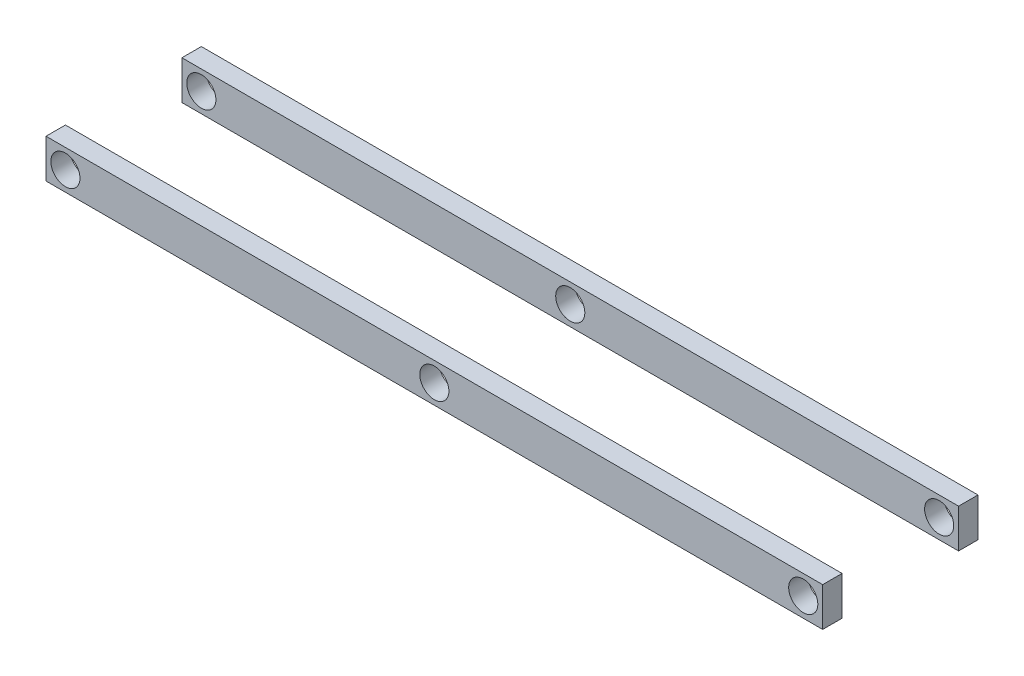
ISO-10303-21;
HEADER;
FILE_DESCRIPTION(('STEP AP214'),'2;1');
FILE_NAME('part.step','',(''),(''),'','','');
FILE_SCHEMA(('AUTOMOTIVE_DESIGN { 1 0 10303 214 1 1 1 1 }'));
ENDSEC;
DATA;
#1=APPLICATION_CONTEXT('core data for automotive mechanical design processes');
#2=APPLICATION_PROTOCOL_DEFINITION('international standard','automotive_design',2000,#1);
#3=PRODUCT_CONTEXT('',#1,'mechanical');
#4=PRODUCT('Part','Part','',(#3));
#5=PRODUCT_RELATED_PRODUCT_CATEGORY('part','',(#4));
#6=PRODUCT_DEFINITION_FORMATION('','',#4);
#7=PRODUCT_DEFINITION_CONTEXT('part definition',#1,'design');
#8=PRODUCT_DEFINITION('design','',#6,#7);
#9=PRODUCT_DEFINITION_SHAPE('','',#8);
#10=(LENGTH_UNIT() NAMED_UNIT(*) SI_UNIT(.MILLI.,.METRE.));
#11=(NAMED_UNIT(*) PLANE_ANGLE_UNIT() SI_UNIT($,.RADIAN.));
#12=(NAMED_UNIT(*) SI_UNIT($,.STERADIAN.) SOLID_ANGLE_UNIT());
#13=UNCERTAINTY_MEASURE_WITH_UNIT(LENGTH_MEASURE(1.E-05),#10,'distance_accuracy_value','');
#14=(GEOMETRIC_REPRESENTATION_CONTEXT(3) GLOBAL_UNCERTAINTY_ASSIGNED_CONTEXT((#13)) GLOBAL_UNIT_ASSIGNED_CONTEXT((#10,
#11,#12)) REPRESENTATION_CONTEXT('',''));
#15=CARTESIAN_POINT('',(0.,0.,0.));
#16=DIRECTION('',(0.,0.,1.));
#17=DIRECTION('',(1.,0.,0.));
#18=AXIS2_PLACEMENT_3D('',#15,#16,#17);
#19=CARTESIAN_POINT('',(0.,2.,0.));
#20=DIRECTION('',(1.,0.,0.));
#21=DIRECTION('',(0.,0.,-1.));
#22=AXIS2_PLACEMENT_3D('',#19,#20,#21);
#23=PLANE('',#22);
#24=DIRECTION('',(0.,0.,1.));
#25=VECTOR('',#24,1.);
#26=CARTESIAN_POINT('',(0.,0.,0.));
#27=LINE('',#26,#25);
#28=CARTESIAN_POINT('',(0.,0.,-8.));
#29=VERTEX_POINT('',#28);
#30=CARTESIAN_POINT('',(0.,0.,-7.));
#31=VERTEX_POINT('',#30);
#32=EDGE_CURVE('E94',#29,#31,#27,.T.);
#33=ORIENTED_EDGE('',*,*,#32,.T.);
#34=DIRECTION('',(0.,1.,0.));
#35=VECTOR('',#34,1.);
#36=CARTESIAN_POINT('',(0.,0.,-7.));
#37=LINE('',#36,#35);
#38=CARTESIAN_POINT('',(0.,2.,-7.));
#39=VERTEX_POINT('',#38);
#40=EDGE_CURVE('E84',#31,#39,#37,.T.);
#41=ORIENTED_EDGE('',*,*,#40,.T.);
#42=DIRECTION('',(0.,0.,1.));
#43=VECTOR('',#42,1.);
#44=CARTESIAN_POINT('',(0.,2.,0.));
#45=LINE('',#44,#43);
#46=CARTESIAN_POINT('',(0.,2.,-8.));
#47=VERTEX_POINT('',#46);
#48=EDGE_CURVE('E191',#47,#39,#45,.T.);
#49=ORIENTED_EDGE('',*,*,#48,.F.);
#50=DIRECTION('',(0.,-1.,0.));
#51=VECTOR('',#50,1.);
#52=CARTESIAN_POINT('',(0.,2.,-8.));
#53=LINE('',#52,#51);
#54=EDGE_CURVE('E93',#47,#29,#53,.T.);
#55=ORIENTED_EDGE('',*,*,#54,.T.);
#56=EDGE_LOOP('',(#33,#41,#49,#55));
#57=FACE_BOUND('',#56,.T.);
#58=ADVANCED_FACE('F49',(#57),#23,.F.);
#59=CARTESIAN_POINT('',(40.,2.,0.));
#60=DIRECTION('',(-1.,0.,0.));
#61=DIRECTION('',(0.,0.,1.));
#62=AXIS2_PLACEMENT_3D('',#59,#60,#61);
#63=PLANE('',#62);
#64=DIRECTION('',(0.,0.,-1.));
#65=VECTOR('',#64,1.);
#66=CARTESIAN_POINT('',(40.,2.,0.));
#67=LINE('',#66,#65);
#68=CARTESIAN_POINT('',(40.,2.,-7.));
#69=VERTEX_POINT('',#68);
#70=CARTESIAN_POINT('',(40.,2.,-8.));
#71=VERTEX_POINT('',#70);
#72=EDGE_CURVE('E186',#69,#71,#67,.T.);
#73=ORIENTED_EDGE('',*,*,#72,.F.);
#74=DIRECTION('',(0.,1.,0.));
#75=VECTOR('',#74,1.);
#76=CARTESIAN_POINT('',(40.,0.,-7.));
#77=LINE('',#76,#75);
#78=CARTESIAN_POINT('',(40.,0.,-7.));
#79=VERTEX_POINT('',#78);
#80=EDGE_CURVE('E12',#79,#69,#77,.T.);
#81=ORIENTED_EDGE('',*,*,#80,.F.);
#82=DIRECTION('',(0.,0.,-1.));
#83=VECTOR('',#82,1.);
#84=CARTESIAN_POINT('',(40.,0.,0.));
#85=LINE('',#84,#83);
#86=CARTESIAN_POINT('',(40.,0.,-8.));
#87=VERTEX_POINT('',#86);
#88=EDGE_CURVE('E101',#79,#87,#85,.T.);
#89=ORIENTED_EDGE('',*,*,#88,.T.);
#90=DIRECTION('',(0.,-1.,0.));
#91=VECTOR('',#90,1.);
#92=CARTESIAN_POINT('',(40.,2.,-8.));
#93=LINE('',#92,#91);
#94=EDGE_CURVE('E178',#71,#87,#93,.T.);
#95=ORIENTED_EDGE('',*,*,#94,.F.);
#96=EDGE_LOOP('',(#73,#81,#89,#95));
#97=FACE_BOUND('',#96,.T.);
#98=ADVANCED_FACE('F142',(#97),#63,.F.);
#99=CARTESIAN_POINT('',(0.,2.,0.));
#100=DIRECTION('',(0.,-1.,0.));
#101=DIRECTION('',(0.,0.,-1.));
#102=AXIS2_PLACEMENT_3D('',#99,#100,#101);
#103=PLANE('',#102);
#104=ORIENTED_EDGE('',*,*,#48,.T.);
#105=DIRECTION('',(-1.,0.,0.));
#106=VECTOR('',#105,1.);
#107=CARTESIAN_POINT('',(0.,2.,-7.));
#108=LINE('',#107,#106);
#109=EDGE_CURVE('E59',#69,#39,#108,.T.);
#110=ORIENTED_EDGE('',*,*,#109,.F.);
#111=ORIENTED_EDGE('',*,*,#72,.T.);
#112=DIRECTION('',(-1.,0.,0.));
#113=VECTOR('',#112,1.);
#114=CARTESIAN_POINT('',(0.,2.,-8.));
#115=LINE('',#114,#113);
#116=EDGE_CURVE('E104',#71,#47,#115,.T.);
#117=ORIENTED_EDGE('',*,*,#116,.T.);
#118=EDGE_LOOP('',(#104,#110,#111,#117));
#119=FACE_BOUND('',#118,.T.);
#120=ADVANCED_FACE('F146',(#119),#103,.F.);
#121=CARTESIAN_POINT('',(0.,0.,0.));
#122=DIRECTION('',(0.,-1.,0.));
#123=DIRECTION('',(0.,0.,-1.));
#124=AXIS2_PLACEMENT_3D('',#121,#122,#123);
#125=PLANE('',#124);
#126=DIRECTION('',(-1.,0.,0.));
#127=VECTOR('',#126,1.);
#128=CARTESIAN_POINT('',(0.,0.,-7.));
#129=LINE('',#128,#127);
#130=EDGE_CURVE('E87',#79,#31,#129,.T.);
#131=ORIENTED_EDGE('',*,*,#130,.T.);
#132=ORIENTED_EDGE('',*,*,#32,.F.);
#133=DIRECTION('',(-1.,0.,0.));
#134=VECTOR('',#133,1.);
#135=CARTESIAN_POINT('',(0.,0.,-8.));
#136=LINE('',#135,#134);
#137=EDGE_CURVE('E103',#87,#29,#136,.T.);
#138=ORIENTED_EDGE('',*,*,#137,.F.);
#139=ORIENTED_EDGE('',*,*,#88,.F.);
#140=EDGE_LOOP('',(#131,#132,#138,#139));
#141=FACE_BOUND('',#140,.T.);
#142=ADVANCED_FACE('F99',(#141),#125,.T.);
#143=CARTESIAN_POINT('',(0.,2.,-8.));
#144=DIRECTION('',(0.,0.,1.));
#145=DIRECTION('',(1.,0.,0.));
#146=AXIS2_PLACEMENT_3D('',#143,#144,#145);
#147=PLANE('',#146);
#148=CARTESIAN_POINT('',(20.,1.,-8.));
#149=DIRECTION('',(0.,0.,1.));
#150=DIRECTION('',(1.,0.,0.));
#151=AXIS2_PLACEMENT_3D('',#148,#149,#150);
#152=CIRCLE('',#151,0.750000000000002);
#153=CARTESIAN_POINT('',(20.75,1.,-8.));
#154=VERTEX_POINT('',#153);
#155=EDGE_CURVE('E119',#154,#154,#152,.T.);
#156=ORIENTED_EDGE('',*,*,#155,.T.);
#157=EDGE_LOOP('',(#156));
#158=FACE_BOUND('',#157,.T.);
#159=CARTESIAN_POINT('',(1.,1.,-8.));
#160=DIRECTION('',(0.,0.,1.));
#161=DIRECTION('',(1.,0.,0.));
#162=AXIS2_PLACEMENT_3D('',#159,#160,#161);
#163=CIRCLE('',#162,0.75);
#164=CARTESIAN_POINT('',(1.75,1.,-8.));
#165=VERTEX_POINT('',#164);
#166=EDGE_CURVE('E170',#165,#165,#163,.T.);
#167=ORIENTED_EDGE('',*,*,#166,.T.);
#168=EDGE_LOOP('',(#167));
#169=FACE_BOUND('',#168,.T.);
#170=CARTESIAN_POINT('',(39.,1.,-8.));
#171=DIRECTION('',(0.,0.,1.));
#172=DIRECTION('',(1.,0.,0.));
#173=AXIS2_PLACEMENT_3D('',#170,#171,#172);
#174=CIRCLE('',#173,0.749999999999999);
#175=CARTESIAN_POINT('',(39.75,1.,-8.));
#176=VERTEX_POINT('',#175);
#177=EDGE_CURVE('E174',#176,#176,#174,.T.);
#178=ORIENTED_EDGE('',*,*,#177,.T.);
#179=EDGE_LOOP('',(#178));
#180=FACE_BOUND('',#179,.T.);
#181=ORIENTED_EDGE('',*,*,#137,.T.);
#182=ORIENTED_EDGE('',*,*,#54,.F.);
#183=ORIENTED_EDGE('',*,*,#116,.F.);
#184=ORIENTED_EDGE('',*,*,#94,.T.);
#185=EDGE_LOOP('',(#181,#182,#183,#184));
#186=FACE_BOUND('',#185,.T.);
#187=ADVANCED_FACE('F156',(#158,#169,#180,#186),#147,.F.);
#188=CARTESIAN_POINT('',(0.,0.,-7.));
#189=DIRECTION('',(0.,0.,-1.));
#190=DIRECTION('',(-1.,0.,0.));
#191=AXIS2_PLACEMENT_3D('',#188,#189,#190);
#192=PLANE('',#191);
#193=CARTESIAN_POINT('',(20.,1.,-7.));
#194=DIRECTION('',(0.,0.,-1.));
#195=DIRECTION('',(-1.,0.,0.));
#196=AXIS2_PLACEMENT_3D('',#193,#194,#195);
#197=CIRCLE('',#196,0.750000000000002);
#198=CARTESIAN_POINT('',(19.25,1.,-7.));
#199=VERTEX_POINT('',#198);
#200=EDGE_CURVE('E52',#199,#199,#197,.T.);
#201=ORIENTED_EDGE('',*,*,#200,.T.);
#202=EDGE_LOOP('',(#201));
#203=FACE_BOUND('',#202,.T.);
#204=CARTESIAN_POINT('',(1.,1.,-7.));
#205=DIRECTION('',(0.,0.,-1.));
#206=DIRECTION('',(-1.,0.,0.));
#207=AXIS2_PLACEMENT_3D('',#204,#205,#206);
#208=CIRCLE('',#207,0.75);
#209=CARTESIAN_POINT('',(0.25,1.,-7.));
#210=VERTEX_POINT('',#209);
#211=EDGE_CURVE('E112',#210,#210,#208,.T.);
#212=ORIENTED_EDGE('',*,*,#211,.T.);
#213=EDGE_LOOP('',(#212));
#214=FACE_BOUND('',#213,.T.);
#215=CARTESIAN_POINT('',(39.,1.,-7.));
#216=DIRECTION('',(0.,0.,-1.));
#217=DIRECTION('',(-1.,0.,0.));
#218=AXIS2_PLACEMENT_3D('',#215,#216,#217);
#219=CIRCLE('',#218,0.749999999999999);
#220=CARTESIAN_POINT('',(38.25,1.,-7.));
#221=VERTEX_POINT('',#220);
#222=EDGE_CURVE('E116',#221,#221,#219,.T.);
#223=ORIENTED_EDGE('',*,*,#222,.T.);
#224=EDGE_LOOP('',(#223));
#225=FACE_BOUND('',#224,.T.);
#226=ORIENTED_EDGE('',*,*,#109,.T.);
#227=ORIENTED_EDGE('',*,*,#40,.F.);
#228=ORIENTED_EDGE('',*,*,#130,.F.);
#229=ORIENTED_EDGE('',*,*,#80,.T.);
#230=EDGE_LOOP('',(#226,#227,#228,#229));
#231=FACE_BOUND('',#230,.T.);
#232=ADVANCED_FACE('F86',(#203,#214,#225,#231),#192,.F.);
#233=CARTESIAN_POINT('',(39.,1.,-8.));
#234=DIRECTION('',(0.,0.,1.));
#235=DIRECTION('',(1.,0.,0.));
#236=AXIS2_PLACEMENT_3D('',#233,#234,#235);
#237=CYLINDRICAL_SURFACE('',#236,0.749999999999999);
#238=ORIENTED_EDGE('',*,*,#177,.F.);
#239=EDGE_LOOP('',(#238));
#240=FACE_BOUND('',#239,.T.);
#241=ORIENTED_EDGE('',*,*,#222,.F.);
#242=EDGE_LOOP('',(#241));
#243=FACE_BOUND('',#242,.T.);
#244=ADVANCED_FACE('F129',(#240,#243),#237,.F.);
#245=CARTESIAN_POINT('',(1.,1.,-8.));
#246=DIRECTION('',(0.,0.,1.));
#247=DIRECTION('',(1.,0.,0.));
#248=AXIS2_PLACEMENT_3D('',#245,#246,#247);
#249=CYLINDRICAL_SURFACE('',#248,0.75);
#250=ORIENTED_EDGE('',*,*,#166,.F.);
#251=EDGE_LOOP('',(#250));
#252=FACE_BOUND('',#251,.T.);
#253=ORIENTED_EDGE('',*,*,#211,.F.);
#254=EDGE_LOOP('',(#253));
#255=FACE_BOUND('',#254,.T.);
#256=ADVANCED_FACE('F126',(#252,#255),#249,.F.);
#257=CARTESIAN_POINT('',(20.,1.,-8.));
#258=DIRECTION('',(0.,0.,1.));
#259=DIRECTION('',(1.,0.,0.));
#260=AXIS2_PLACEMENT_3D('',#257,#258,#259);
#261=CYLINDRICAL_SURFACE('',#260,0.750000000000002);
#262=ORIENTED_EDGE('',*,*,#155,.F.);
#263=EDGE_LOOP('',(#262));
#264=FACE_BOUND('',#263,.T.);
#265=ORIENTED_EDGE('',*,*,#200,.F.);
#266=EDGE_LOOP('',(#265));
#267=FACE_BOUND('',#266,.T.);
#268=ADVANCED_FACE('F128',(#264,#267),#261,.F.);
#269=CLOSED_SHELL('',(#58,#98,#120,#142,#187,#232,#244,#256,#268));
#270=MANIFOLD_SOLID_BREP('B2',#269);
#271=CARTESIAN_POINT('',(0.,2.,0.));
#272=DIRECTION('',(0.,0.,-1.));
#273=DIRECTION('',(-1.,0.,0.));
#274=AXIS2_PLACEMENT_3D('',#271,#272,#273);
#275=PLANE('',#274);
#276=CARTESIAN_POINT('',(20.,1.,0.));
#277=DIRECTION('',(0.,0.,1.));
#278=DIRECTION('',(1.,0.,0.));
#279=AXIS2_PLACEMENT_3D('',#276,#277,#278);
#280=CIRCLE('',#279,0.750000000000002);
#281=CARTESIAN_POINT('',(20.75,1.,0.));
#282=VERTEX_POINT('',#281);
#283=EDGE_CURVE('E317',#282,#282,#280,.T.);
#284=ORIENTED_EDGE('',*,*,#283,.F.);
#285=EDGE_LOOP('',(#284));
#286=FACE_BOUND('',#285,.T.);
#287=CARTESIAN_POINT('',(1.,1.,0.));
#288=DIRECTION('',(0.,0.,1.));
#289=DIRECTION('',(1.,0.,0.));
#290=AXIS2_PLACEMENT_3D('',#287,#288,#289);
#291=CIRCLE('',#290,0.75);
#292=CARTESIAN_POINT('',(1.75,1.,0.));
#293=VERTEX_POINT('',#292);
#294=EDGE_CURVE('E386',#293,#293,#291,.T.);
#295=ORIENTED_EDGE('',*,*,#294,.F.);
#296=EDGE_LOOP('',(#295));
#297=FACE_BOUND('',#296,.T.);
#298=CARTESIAN_POINT('',(39.,1.,0.));
#299=DIRECTION('',(0.,0.,1.));
#300=DIRECTION('',(1.,0.,0.));
#301=AXIS2_PLACEMENT_3D('',#298,#299,#300);
#302=CIRCLE('',#301,0.749999999999999);
#303=CARTESIAN_POINT('',(39.75,1.,0.));
#304=VERTEX_POINT('',#303);
#305=EDGE_CURVE('E389',#304,#304,#302,.T.);
#306=ORIENTED_EDGE('',*,*,#305,.F.);
#307=EDGE_LOOP('',(#306));
#308=FACE_BOUND('',#307,.T.);
#309=DIRECTION('',(1.,0.,0.));
#310=VECTOR('',#309,1.);
#311=CARTESIAN_POINT('',(0.,0.,0.));
#312=LINE('',#311,#310);
#313=CARTESIAN_POINT('',(0.,0.,0.));
#314=VERTEX_POINT('',#313);
#315=CARTESIAN_POINT('',(40.,0.,0.));
#316=VERTEX_POINT('',#315);
#317=EDGE_CURVE('E292',#314,#316,#312,.T.);
#318=ORIENTED_EDGE('',*,*,#317,.T.);
#319=DIRECTION('',(0.,-1.,0.));
#320=VECTOR('',#319,1.);
#321=CARTESIAN_POINT('',(40.,2.,0.));
#322=LINE('',#321,#320);
#323=CARTESIAN_POINT('',(40.,2.,0.));
#324=VERTEX_POINT('',#323);
#325=EDGE_CURVE('E263',#324,#316,#322,.T.);
#326=ORIENTED_EDGE('',*,*,#325,.F.);
#327=DIRECTION('',(1.,0.,0.));
#328=VECTOR('',#327,1.);
#329=CARTESIAN_POINT('',(0.,2.,0.));
#330=LINE('',#329,#328);
#331=CARTESIAN_POINT('',(0.,2.,0.));
#332=VERTEX_POINT('',#331);
#333=EDGE_CURVE('E280',#332,#324,#330,.T.);
#334=ORIENTED_EDGE('',*,*,#333,.F.);
#335=DIRECTION('',(0.,-1.,0.));
#336=VECTOR('',#335,1.);
#337=CARTESIAN_POINT('',(0.,2.,0.));
#338=LINE('',#337,#336);
#339=EDGE_CURVE('E47',#332,#314,#338,.T.);
#340=ORIENTED_EDGE('',*,*,#339,.T.);
#341=EDGE_LOOP('',(#318,#326,#334,#340));
#342=FACE_BOUND('',#341,.T.);
#343=ADVANCED_FACE('F254',(#286,#297,#308,#342),#275,.F.);
#344=CARTESIAN_POINT('',(0.,2.,0.));
#345=DIRECTION('',(0.,-1.,0.));
#346=DIRECTION('',(0.,0.,-1.));
#347=AXIS2_PLACEMENT_3D('',#344,#345,#346);
#348=PLANE('',#347);
#349=DIRECTION('',(0.,0.,-1.));
#350=VECTOR('',#349,1.);
#351=CARTESIAN_POINT('',(40.,2.,0.));
#352=LINE('',#351,#350);
#353=CARTESIAN_POINT('',(40.,2.,-1.));
#354=VERTEX_POINT('',#353);
#355=EDGE_CURVE('E305',#324,#354,#352,.T.);
#356=ORIENTED_EDGE('',*,*,#355,.T.);
#357=DIRECTION('',(1.,0.,0.));
#358=VECTOR('',#357,1.);
#359=CARTESIAN_POINT('',(40.,2.,-1.));
#360=LINE('',#359,#358);
#361=CARTESIAN_POINT('',(0.,2.,-0.999999999999995));
#362=VERTEX_POINT('',#361);
#363=EDGE_CURVE('E322',#362,#354,#360,.T.);
#364=ORIENTED_EDGE('',*,*,#363,.F.);
#365=DIRECTION('',(0.,0.,1.));
#366=VECTOR('',#365,1.);
#367=CARTESIAN_POINT('',(0.,2.,0.));
#368=LINE('',#367,#366);
#369=EDGE_CURVE('E309',#362,#332,#368,.T.);
#370=ORIENTED_EDGE('',*,*,#369,.T.);
#371=ORIENTED_EDGE('',*,*,#333,.T.);
#372=EDGE_LOOP('',(#356,#364,#370,#371));
#373=FACE_BOUND('',#372,.T.);
#374=ADVANCED_FACE('F343',(#373),#348,.F.);
#375=CARTESIAN_POINT('',(0.,0.,0.));
#376=DIRECTION('',(0.,-1.,0.));
#377=DIRECTION('',(0.,0.,-1.));
#378=AXIS2_PLACEMENT_3D('',#375,#376,#377);
#379=PLANE('',#378);
#380=DIRECTION('',(1.,0.,0.));
#381=VECTOR('',#380,1.);
#382=CARTESIAN_POINT('',(40.,0.,-1.));
#383=LINE('',#382,#381);
#384=CARTESIAN_POINT('',(0.,0.,-0.999999999999995));
#385=VERTEX_POINT('',#384);
#386=CARTESIAN_POINT('',(40.,0.,-0.999999999999997));
#387=VERTEX_POINT('',#386);
#388=EDGE_CURVE('E308',#385,#387,#383,.T.);
#389=ORIENTED_EDGE('',*,*,#388,.T.);
#390=DIRECTION('',(0.,0.,-1.));
#391=VECTOR('',#390,1.);
#392=CARTESIAN_POINT('',(40.,0.,0.));
#393=LINE('',#392,#391);
#394=EDGE_CURVE('E299',#316,#387,#393,.T.);
#395=ORIENTED_EDGE('',*,*,#394,.F.);
#396=ORIENTED_EDGE('',*,*,#317,.F.);
#397=DIRECTION('',(0.,0.,1.));
#398=VECTOR('',#397,1.);
#399=CARTESIAN_POINT('',(0.,0.,0.));
#400=LINE('',#399,#398);
#401=EDGE_CURVE('E300',#385,#314,#400,.T.);
#402=ORIENTED_EDGE('',*,*,#401,.F.);
#403=EDGE_LOOP('',(#389,#395,#396,#402));
#404=FACE_BOUND('',#403,.T.);
#405=ADVANCED_FACE('F307',(#404),#379,.T.);
#406=CARTESIAN_POINT('',(40.,2.,0.));
#407=DIRECTION('',(-1.,0.,0.));
#408=DIRECTION('',(0.,0.,1.));
#409=AXIS2_PLACEMENT_3D('',#406,#407,#408);
#410=PLANE('',#409);
#411=ORIENTED_EDGE('',*,*,#394,.T.);
#412=DIRECTION('',(0.,1.,0.));
#413=VECTOR('',#412,1.);
#414=CARTESIAN_POINT('',(40.,0.,-1.));
#415=LINE('',#414,#413);
#416=EDGE_CURVE('E271',#387,#354,#415,.T.);
#417=ORIENTED_EDGE('',*,*,#416,.T.);
#418=ORIENTED_EDGE('',*,*,#355,.F.);
#419=ORIENTED_EDGE('',*,*,#325,.T.);
#420=EDGE_LOOP('',(#411,#417,#418,#419));
#421=FACE_BOUND('',#420,.T.);
#422=ADVANCED_FACE('F304',(#421),#410,.F.);
#423=CARTESIAN_POINT('',(0.,2.,0.));
#424=DIRECTION('',(1.,0.,0.));
#425=DIRECTION('',(0.,0.,-1.));
#426=AXIS2_PLACEMENT_3D('',#423,#424,#425);
#427=PLANE('',#426);
#428=ORIENTED_EDGE('',*,*,#369,.F.);
#429=DIRECTION('',(0.,1.,0.));
#430=VECTOR('',#429,1.);
#431=CARTESIAN_POINT('',(0.,0.,-0.999999999999995));
#432=LINE('',#431,#430);
#433=EDGE_CURVE('E329',#385,#362,#432,.T.);
#434=ORIENTED_EDGE('',*,*,#433,.F.);
#435=ORIENTED_EDGE('',*,*,#401,.T.);
#436=ORIENTED_EDGE('',*,*,#339,.F.);
#437=EDGE_LOOP('',(#428,#434,#435,#436));
#438=FACE_BOUND('',#437,.T.);
#439=ADVANCED_FACE('F256',(#438),#427,.F.);
#440=CARTESIAN_POINT('',(40.,0.,-1.));
#441=DIRECTION('',(0.,0.,1.));
#442=DIRECTION('',(1.,0.,0.));
#443=AXIS2_PLACEMENT_3D('',#440,#441,#442);
#444=PLANE('',#443);
#445=CARTESIAN_POINT('',(20.,1.,-0.999999999999997));
#446=DIRECTION('',(0.,0.,1.));
#447=DIRECTION('',(1.,0.,0.));
#448=AXIS2_PLACEMENT_3D('',#445,#446,#447);
#449=CIRCLE('',#448,0.750000000000002);
#450=CARTESIAN_POINT('',(20.75,1.,-0.999999999999997));
#451=VERTEX_POINT('',#450);
#452=EDGE_CURVE('E258',#451,#451,#449,.T.);
#453=ORIENTED_EDGE('',*,*,#452,.T.);
#454=EDGE_LOOP('',(#453));
#455=FACE_BOUND('',#454,.T.);
#456=CARTESIAN_POINT('',(1.,1.,-0.999999999999995));
#457=DIRECTION('',(0.,0.,1.));
#458=DIRECTION('',(1.,0.,0.));
#459=AXIS2_PLACEMENT_3D('',#456,#457,#458);
#460=CIRCLE('',#459,0.75);
#461=CARTESIAN_POINT('',(1.75,1.,-0.999999999999995));
#462=VERTEX_POINT('',#461);
#463=EDGE_CURVE('E316',#462,#462,#460,.T.);
#464=ORIENTED_EDGE('',*,*,#463,.T.);
#465=EDGE_LOOP('',(#464));
#466=FACE_BOUND('',#465,.T.);
#467=CARTESIAN_POINT('',(39.,1.,-1.));
#468=DIRECTION('',(0.,0.,1.));
#469=DIRECTION('',(1.,0.,0.));
#470=AXIS2_PLACEMENT_3D('',#467,#468,#469);
#471=CIRCLE('',#470,0.749999999999999);
#472=CARTESIAN_POINT('',(39.75,1.,-1.));
#473=VERTEX_POINT('',#472);
#474=EDGE_CURVE('E314',#473,#473,#471,.T.);
#475=ORIENTED_EDGE('',*,*,#474,.T.);
#476=EDGE_LOOP('',(#475));
#477=FACE_BOUND('',#476,.T.);
#478=ORIENTED_EDGE('',*,*,#363,.T.);
#479=ORIENTED_EDGE('',*,*,#416,.F.);
#480=ORIENTED_EDGE('',*,*,#388,.F.);
#481=ORIENTED_EDGE('',*,*,#433,.T.);
#482=EDGE_LOOP('',(#478,#479,#480,#481));
#483=FACE_BOUND('',#482,.T.);
#484=ADVANCED_FACE('F342',(#455,#466,#477,#483),#444,.F.);
#485=CARTESIAN_POINT('',(39.,1.,-8.));
#486=DIRECTION('',(0.,0.,1.));
#487=DIRECTION('',(1.,0.,0.));
#488=AXIS2_PLACEMENT_3D('',#485,#486,#487);
#489=CYLINDRICAL_SURFACE('',#488,0.749999999999999);
#490=ORIENTED_EDGE('',*,*,#305,.T.);
#491=EDGE_LOOP('',(#490));
#492=FACE_BOUND('',#491,.T.);
#493=ORIENTED_EDGE('',*,*,#474,.F.);
#494=EDGE_LOOP('',(#493));
#495=FACE_BOUND('',#494,.T.);
#496=ADVANCED_FACE('F362',(#492,#495),#489,.F.);
#497=CARTESIAN_POINT('',(1.,1.,-8.));
#498=DIRECTION('',(0.,0.,1.));
#499=DIRECTION('',(1.,0.,0.));
#500=AXIS2_PLACEMENT_3D('',#497,#498,#499);
#501=CYLINDRICAL_SURFACE('',#500,0.75);
#502=ORIENTED_EDGE('',*,*,#294,.T.);
#503=EDGE_LOOP('',(#502));
#504=FACE_BOUND('',#503,.T.);
#505=ORIENTED_EDGE('',*,*,#463,.F.);
#506=EDGE_LOOP('',(#505));
#507=FACE_BOUND('',#506,.T.);
#508=ADVANCED_FACE('F366',(#504,#507),#501,.F.);
#509=CARTESIAN_POINT('',(20.,1.,-8.));
#510=DIRECTION('',(0.,0.,1.));
#511=DIRECTION('',(1.,0.,0.));
#512=AXIS2_PLACEMENT_3D('',#509,#510,#511);
#513=CYLINDRICAL_SURFACE('',#512,0.750000000000002);
#514=ORIENTED_EDGE('',*,*,#283,.T.);
#515=EDGE_LOOP('',(#514));
#516=FACE_BOUND('',#515,.T.);
#517=ORIENTED_EDGE('',*,*,#452,.F.);
#518=EDGE_LOOP('',(#517));
#519=FACE_BOUND('',#518,.T.);
#520=ADVANCED_FACE('F374',(#516,#519),#513,.F.);
#521=CLOSED_SHELL('',(#343,#374,#405,#422,#439,#484,#496,#508,#520));
#522=MANIFOLD_SOLID_BREP('B6',#521);
#523=ADVANCED_BREP_SHAPE_REPRESENTATION('',(#18,#270,#522),#14);
#524=SHAPE_DEFINITION_REPRESENTATION(#9,#523);
ENDSEC;
END-ISO-10303-21;
